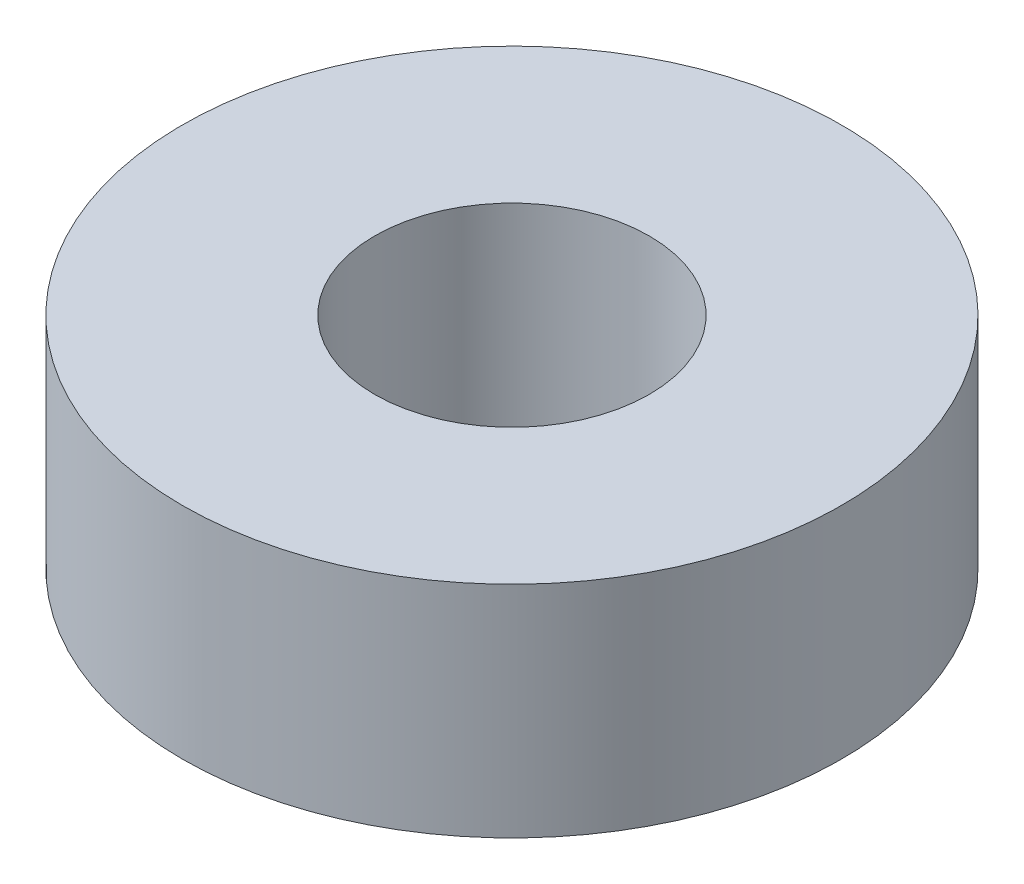
ISO-10303-21;
HEADER;
FILE_DESCRIPTION(('STEP AP214'),'2;1');
FILE_NAME('part.step','',(''),(''),'','','');
FILE_SCHEMA(('AUTOMOTIVE_DESIGN { 1 0 10303 214 1 1 1 1 }'));
ENDSEC;
DATA;
#1=APPLICATION_CONTEXT('core data for automotive mechanical design processes');
#2=APPLICATION_PROTOCOL_DEFINITION('international standard','automotive_design',2000,#1);
#3=PRODUCT_CONTEXT('',#1,'mechanical');
#4=PRODUCT('Part','Part','',(#3));
#5=PRODUCT_RELATED_PRODUCT_CATEGORY('part','',(#4));
#6=PRODUCT_DEFINITION_FORMATION('','',#4);
#7=PRODUCT_DEFINITION_CONTEXT('part definition',#1,'design');
#8=PRODUCT_DEFINITION('design','',#6,#7);
#9=PRODUCT_DEFINITION_SHAPE('','',#8);
#10=(LENGTH_UNIT() NAMED_UNIT(*) SI_UNIT(.MILLI.,.METRE.));
#11=(NAMED_UNIT(*) PLANE_ANGLE_UNIT() SI_UNIT($,.RADIAN.));
#12=(NAMED_UNIT(*) SI_UNIT($,.STERADIAN.) SOLID_ANGLE_UNIT());
#13=UNCERTAINTY_MEASURE_WITH_UNIT(LENGTH_MEASURE(1.E-05),#10,'distance_accuracy_value','');
#14=(GEOMETRIC_REPRESENTATION_CONTEXT(3) GLOBAL_UNCERTAINTY_ASSIGNED_CONTEXT((#13)) GLOBAL_UNIT_ASSIGNED_CONTEXT((#10,
#11,#12)) REPRESENTATION_CONTEXT('',''));
#15=CARTESIAN_POINT('',(0.,0.,0.));
#16=DIRECTION('',(0.,0.,1.));
#17=DIRECTION('',(1.,0.,0.));
#18=AXIS2_PLACEMENT_3D('',#15,#16,#17);
#19=CARTESIAN_POINT('',(0.,4.,0.));
#20=DIRECTION('',(0.,1.,0.));
#21=DIRECTION('',(0.,0.,1.));
#22=AXIS2_PLACEMENT_3D('',#19,#20,#21);
#23=PLANE('',#22);
#24=CARTESIAN_POINT('',(0.,4.,0.));
#25=DIRECTION('',(0.,1.,0.));
#26=DIRECTION('',(0.,0.,1.));
#27=AXIS2_PLACEMENT_3D('',#24,#25,#26);
#28=CIRCLE('',#27,6.);
#29=CARTESIAN_POINT('',(0.,4.,6.));
#30=VERTEX_POINT('',#29);
#31=EDGE_CURVE('E10',#30,#30,#28,.T.);
#32=ORIENTED_EDGE('',*,*,#31,.T.);
#33=EDGE_LOOP('',(#32));
#34=FACE_BOUND('',#33,.T.);
#35=CARTESIAN_POINT('',(0.,4.,0.));
#36=DIRECTION('',(0.,1.,0.));
#37=DIRECTION('',(0.,0.,1.));
#38=AXIS2_PLACEMENT_3D('',#35,#36,#37);
#39=CIRCLE('',#38,2.5);
#40=CARTESIAN_POINT('',(0.,4.,2.5));
#41=VERTEX_POINT('',#40);
#42=EDGE_CURVE('E43',#41,#41,#39,.T.);
#43=ORIENTED_EDGE('',*,*,#42,.F.);
#44=EDGE_LOOP('',(#43));
#45=FACE_BOUND('',#44,.T.);
#46=ADVANCED_FACE('F32',(#34,#45),#23,.T.);
#47=CARTESIAN_POINT('',(0.,0.,0.));
#48=DIRECTION('',(0.,1.,0.));
#49=DIRECTION('',(0.,0.,1.));
#50=AXIS2_PLACEMENT_3D('',#47,#48,#49);
#51=PLANE('',#50);
#52=CARTESIAN_POINT('',(0.,0.,0.));
#53=DIRECTION('',(0.,1.,0.));
#54=DIRECTION('',(0.,0.,1.));
#55=AXIS2_PLACEMENT_3D('',#52,#53,#54);
#56=CIRCLE('',#55,6.);
#57=CARTESIAN_POINT('',(0.,0.,6.));
#58=VERTEX_POINT('',#57);
#59=EDGE_CURVE('E36',#58,#58,#56,.T.);
#60=ORIENTED_EDGE('',*,*,#59,.F.);
#61=EDGE_LOOP('',(#60));
#62=FACE_BOUND('',#61,.T.);
#63=CARTESIAN_POINT('',(0.,0.,0.));
#64=DIRECTION('',(0.,1.,0.));
#65=DIRECTION('',(0.,0.,1.));
#66=AXIS2_PLACEMENT_3D('',#63,#64,#65);
#67=CIRCLE('',#66,2.5);
#68=CARTESIAN_POINT('',(0.,0.,2.5));
#69=VERTEX_POINT('',#68);
#70=EDGE_CURVE('E45',#69,#69,#67,.T.);
#71=ORIENTED_EDGE('',*,*,#70,.T.);
#72=EDGE_LOOP('',(#71));
#73=FACE_BOUND('',#72,.T.);
#74=ADVANCED_FACE('F55',(#62,#73),#51,.F.);
#75=CARTESIAN_POINT('',(0.,4.,0.));
#76=DIRECTION('',(0.,-1.,0.));
#77=DIRECTION('',(0.,0.,-1.));
#78=AXIS2_PLACEMENT_3D('',#75,#76,#77);
#79=CYLINDRICAL_SURFACE('',#78,6.);
#80=ORIENTED_EDGE('',*,*,#31,.F.);
#81=EDGE_LOOP('',(#80));
#82=FACE_BOUND('',#81,.T.);
#83=ORIENTED_EDGE('',*,*,#59,.T.);
#84=EDGE_LOOP('',(#83));
#85=FACE_BOUND('',#84,.T.);
#86=ADVANCED_FACE('F34',(#82,#85),#79,.T.);
#87=CARTESIAN_POINT('',(0.,4.,0.));
#88=DIRECTION('',(0.,-1.,0.));
#89=DIRECTION('',(0.,0.,-1.));
#90=AXIS2_PLACEMENT_3D('',#87,#88,#89);
#91=CYLINDRICAL_SURFACE('',#90,2.5);
#92=ORIENTED_EDGE('',*,*,#42,.T.);
#93=EDGE_LOOP('',(#92));
#94=FACE_BOUND('',#93,.T.);
#95=ORIENTED_EDGE('',*,*,#70,.F.);
#96=EDGE_LOOP('',(#95));
#97=FACE_BOUND('',#96,.T.);
#98=ADVANCED_FACE('F51',(#94,#97),#91,.F.);
#99=CLOSED_SHELL('',(#46,#74,#86,#98));
#100=MANIFOLD_SOLID_BREP('B2',#99);
#101=ADVANCED_BREP_SHAPE_REPRESENTATION('',(#18,#100),#14);
#102=SHAPE_DEFINITION_REPRESENTATION(#9,#101);
ENDSEC;
END-ISO-10303-21;
